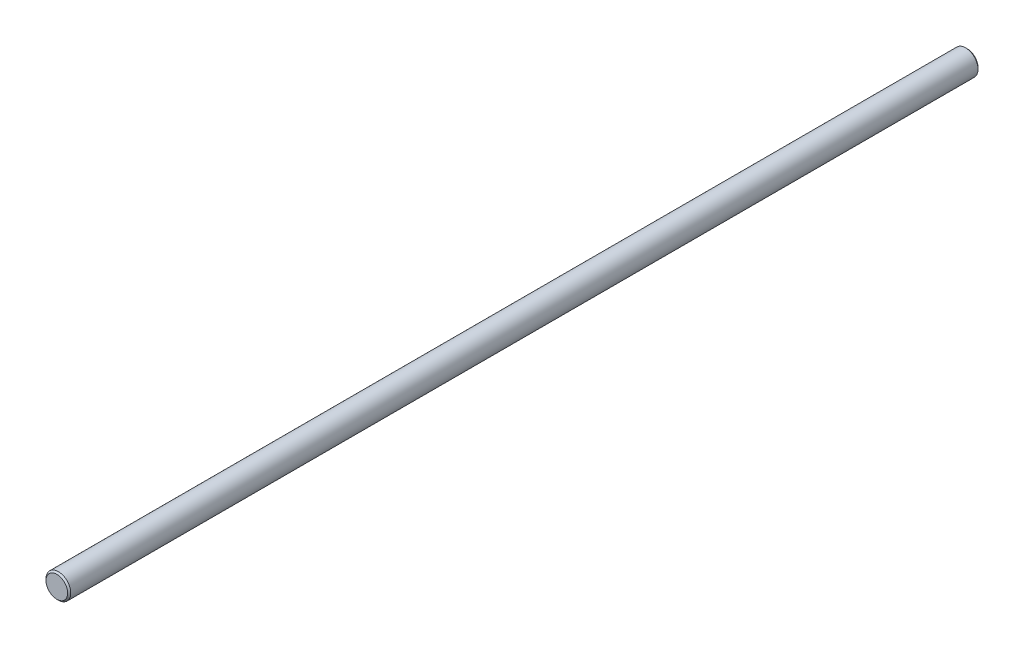
ISO-10303-21;
HEADER;
FILE_DESCRIPTION(('STEP AP214'),'2;1');
FILE_NAME('part.step','',(''),(''),'','','');
FILE_SCHEMA(('AUTOMOTIVE_DESIGN { 1 0 10303 214 1 1 1 1 }'));
ENDSEC;
DATA;
#1=APPLICATION_CONTEXT('core data for automotive mechanical design processes');
#2=APPLICATION_PROTOCOL_DEFINITION('international standard','automotive_design',2000,#1);
#3=PRODUCT_CONTEXT('',#1,'mechanical');
#4=PRODUCT('Part','Part','',(#3));
#5=PRODUCT_RELATED_PRODUCT_CATEGORY('part','',(#4));
#6=PRODUCT_DEFINITION_FORMATION('','',#4);
#7=PRODUCT_DEFINITION_CONTEXT('part definition',#1,'design');
#8=PRODUCT_DEFINITION('design','',#6,#7);
#9=PRODUCT_DEFINITION_SHAPE('','',#8);
#10=(LENGTH_UNIT() NAMED_UNIT(*) SI_UNIT(.MILLI.,.METRE.));
#11=(NAMED_UNIT(*) PLANE_ANGLE_UNIT() SI_UNIT($,.RADIAN.));
#12=(NAMED_UNIT(*) SI_UNIT($,.STERADIAN.) SOLID_ANGLE_UNIT());
#13=UNCERTAINTY_MEASURE_WITH_UNIT(LENGTH_MEASURE(1.E-05),#10,'distance_accuracy_value','');
#14=(GEOMETRIC_REPRESENTATION_CONTEXT(3) GLOBAL_UNCERTAINTY_ASSIGNED_CONTEXT((#13)) GLOBAL_UNIT_ASSIGNED_CONTEXT((#10,
#11,#12)) REPRESENTATION_CONTEXT('',''));
#15=CARTESIAN_POINT('',(0.,0.,0.));
#16=DIRECTION('',(0.,0.,1.));
#17=DIRECTION('',(1.,0.,0.));
#18=AXIS2_PLACEMENT_3D('',#15,#16,#17);
#19=CARTESIAN_POINT('',(0.,0.,293.5));
#20=DIRECTION('',(0.,0.,-1.));
#21=DIRECTION('',(-1.,0.,0.));
#22=AXIS2_PLACEMENT_3D('',#19,#20,#21);
#23=CONICAL_SURFACE('',#22,4.,0.785398163397448);
#24=CARTESIAN_POINT('',(0.,0.,294.));
#25=DIRECTION('',(0.,0.,-1.));
#26=DIRECTION('',(-1.,0.,0.));
#27=AXIS2_PLACEMENT_3D('',#24,#25,#26);
#28=CIRCLE('',#27,3.5);
#29=CARTESIAN_POINT('',(-3.5,0.,294.));
#30=VERTEX_POINT('',#29);
#31=EDGE_CURVE('E42',#30,#30,#28,.T.);
#32=ORIENTED_EDGE('',*,*,#31,.T.);
#33=EDGE_LOOP('',(#32));
#34=FACE_BOUND('',#33,.T.);
#35=CARTESIAN_POINT('',(0.,0.,293.5));
#36=DIRECTION('',(0.,0.,-1.));
#37=DIRECTION('',(-1.,0.,0.));
#38=AXIS2_PLACEMENT_3D('',#35,#36,#37);
#39=CIRCLE('',#38,4.);
#40=CARTESIAN_POINT('',(-4.,0.,293.5));
#41=VERTEX_POINT('',#40);
#42=EDGE_CURVE('E10',#41,#41,#39,.T.);
#43=ORIENTED_EDGE('',*,*,#42,.F.);
#44=EDGE_LOOP('',(#43));
#45=FACE_BOUND('',#44,.T.);
#46=ADVANCED_FACE('F28',(#34,#45),#23,.T.);
#47=CARTESIAN_POINT('',(0.,0.,294.));
#48=DIRECTION('',(0.,0.,-1.));
#49=DIRECTION('',(-1.,0.,0.));
#50=AXIS2_PLACEMENT_3D('',#47,#48,#49);
#51=CYLINDRICAL_SURFACE('',#50,4.);
#52=ORIENTED_EDGE('',*,*,#42,.T.);
#53=EDGE_LOOP('',(#52));
#54=FACE_BOUND('',#53,.T.);
#55=CARTESIAN_POINT('',(0.,0.,0.5));
#56=DIRECTION('',(0.,0.,-1.));
#57=DIRECTION('',(-1.,0.,0.));
#58=AXIS2_PLACEMENT_3D('',#55,#56,#57);
#59=CIRCLE('',#58,4.);
#60=CARTESIAN_POINT('',(-4.,0.,0.5));
#61=VERTEX_POINT('',#60);
#62=EDGE_CURVE('E34',#61,#61,#59,.T.);
#63=ORIENTED_EDGE('',*,*,#62,.F.);
#64=EDGE_LOOP('',(#63));
#65=FACE_BOUND('',#64,.T.);
#66=ADVANCED_FACE('F61',(#54,#65),#51,.T.);
#67=CARTESIAN_POINT('',(0.,0.,0.));
#68=DIRECTION('',(0.,0.,1.));
#69=DIRECTION('',(1.,0.,0.));
#70=AXIS2_PLACEMENT_3D('',#67,#68,#69);
#71=CONICAL_SURFACE('',#70,3.5,0.785398163397448);
#72=ORIENTED_EDGE('',*,*,#62,.T.);
#73=EDGE_LOOP('',(#72));
#74=FACE_BOUND('',#73,.T.);
#75=CARTESIAN_POINT('',(0.,0.,0.));
#76=DIRECTION('',(0.,0.,-1.));
#77=DIRECTION('',(-1.,0.,0.));
#78=AXIS2_PLACEMENT_3D('',#75,#76,#77);
#79=CIRCLE('',#78,3.5);
#80=CARTESIAN_POINT('',(-3.5,0.,0.));
#81=VERTEX_POINT('',#80);
#82=EDGE_CURVE('E38',#81,#81,#79,.T.);
#83=ORIENTED_EDGE('',*,*,#82,.F.);
#84=EDGE_LOOP('',(#83));
#85=FACE_BOUND('',#84,.T.);
#86=ADVANCED_FACE('F57',(#74,#85),#71,.T.);
#87=CARTESIAN_POINT('',(0.,0.,0.));
#88=DIRECTION('',(0.,0.,-1.));
#89=DIRECTION('',(-1.,0.,0.));
#90=AXIS2_PLACEMENT_3D('',#87,#88,#89);
#91=PLANE('',#90);
#92=ORIENTED_EDGE('',*,*,#82,.T.);
#93=EDGE_LOOP('',(#92));
#94=FACE_BOUND('',#93,.T.);
#95=ADVANCED_FACE('F52',(#94),#91,.T.);
#96=CARTESIAN_POINT('',(3.5,0.,294.));
#97=DIRECTION('',(0.,0.,1.));
#98=DIRECTION('',(1.,0.,0.));
#99=AXIS2_PLACEMENT_3D('',#96,#97,#98);
#100=PLANE('',#99);
#101=ORIENTED_EDGE('',*,*,#31,.F.);
#102=EDGE_LOOP('',(#101));
#103=FACE_BOUND('',#102,.T.);
#104=ADVANCED_FACE('F50',(#103),#100,.T.);
#105=CLOSED_SHELL('',(#46,#66,#86,#95,#104));
#106=MANIFOLD_SOLID_BREP('B2',#105);
#107=ADVANCED_BREP_SHAPE_REPRESENTATION('',(#18,#106),#14);
#108=SHAPE_DEFINITION_REPRESENTATION(#9,#107);
ENDSEC;
END-ISO-10303-21;
